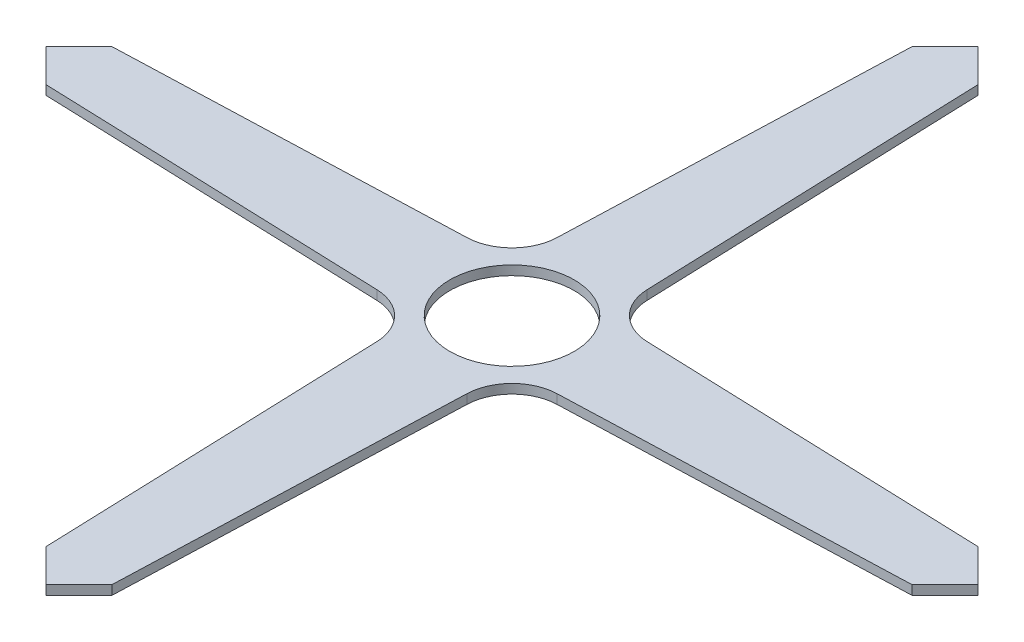
ISO-10303-21;
HEADER;
FILE_DESCRIPTION(('STEP AP214'),'2;1');
FILE_NAME('part.step','',(''),(''),'','','');
FILE_SCHEMA(('AUTOMOTIVE_DESIGN { 1 0 10303 214 1 1 1 1 }'));
ENDSEC;
DATA;
#1=APPLICATION_CONTEXT('core data for automotive mechanical design processes');
#2=APPLICATION_PROTOCOL_DEFINITION('international standard','automotive_design',2000,#1);
#3=PRODUCT_CONTEXT('',#1,'mechanical');
#4=PRODUCT('Part','Part','',(#3));
#5=PRODUCT_RELATED_PRODUCT_CATEGORY('part','',(#4));
#6=PRODUCT_DEFINITION_FORMATION('','',#4);
#7=PRODUCT_DEFINITION_CONTEXT('part definition',#1,'design');
#8=PRODUCT_DEFINITION('design','',#6,#7);
#9=PRODUCT_DEFINITION_SHAPE('','',#8);
#10=(LENGTH_UNIT() NAMED_UNIT(*) SI_UNIT(.MILLI.,.METRE.));
#11=(NAMED_UNIT(*) PLANE_ANGLE_UNIT() SI_UNIT($,.RADIAN.));
#12=(NAMED_UNIT(*) SI_UNIT($,.STERADIAN.) SOLID_ANGLE_UNIT());
#13=UNCERTAINTY_MEASURE_WITH_UNIT(LENGTH_MEASURE(1.E-05),#10,'distance_accuracy_value','');
#14=(GEOMETRIC_REPRESENTATION_CONTEXT(3) GLOBAL_UNCERTAINTY_ASSIGNED_CONTEXT((#13)) GLOBAL_UNIT_ASSIGNED_CONTEXT((#10,
#11,#12)) REPRESENTATION_CONTEXT('',''));
#15=CARTESIAN_POINT('',(0.,0.,0.));
#16=DIRECTION('',(0.,0.,1.));
#17=DIRECTION('',(1.,0.,0.));
#18=AXIS2_PLACEMENT_3D('',#15,#16,#17);
#19=CARTESIAN_POINT('',(0.,3.,0.));
#20=DIRECTION('',(0.,1.,0.));
#21=DIRECTION('',(0.,0.,1.));
#22=AXIS2_PLACEMENT_3D('',#19,#20,#21);
#23=PLANE('',#22);
#24=DIRECTION('',(-0.0352965731020605,0.,0.999376881825496));
#25=VECTOR('',#24,1.);
#26=CARTESIAN_POINT('',(-281.866601717798,3.,-139.393398282199));
#27=LINE('',#26,#25);
#28=CARTESIAN_POINT('',(-281.866601717798,3.,-139.393398282199));
#29=VERTEX_POINT('',#28);
#30=CARTESIAN_POINT('',(-285.766674338683,3.,-28.9678789695326));
#31=VERTEX_POINT('',#30);
#32=EDGE_CURVE('E181',#29,#31,#27,.T.);
#33=ORIENTED_EDGE('',*,*,#32,.T.);
#34=CARTESIAN_POINT('',(-300.757327566065,3.,-29.4973275660635));
#35=DIRECTION('',(0.,1.,0.));
#36=DIRECTION('',(0.,0.,1.));
#37=AXIS2_PLACEMENT_3D('',#34,#35,#36);
#38=CIRCLE('',#37,15.);
#39=CARTESIAN_POINT('',(-300.227878969534,3.,-14.5066743386811));
#40=VERTEX_POINT('',#39);
#41=EDGE_CURVE('E177',#31,#40,#38,.F.);
#42=ORIENTED_EDGE('',*,*,#41,.T.);
#43=DIRECTION('',(-0.999376881825495,0.,0.0352965731020729));
#44=VECTOR('',#43,1.);
#45=CARTESIAN_POINT('',(-286.259999999997,3.,-14.9999999999957));
#46=LINE('',#45,#44);
#47=CARTESIAN_POINT('',(-410.653398282202,3.,-10.6066017177952));
#48=VERTEX_POINT('',#47);
#49=EDGE_CURVE('E169',#40,#48,#46,.T.);
#50=ORIENTED_EDGE('',*,*,#49,.T.);
#51=DIRECTION('',(-0.70710678118655,0.,0.707106781186545));
#52=VECTOR('',#51,1.);
#53=CARTESIAN_POINT('',(-421.26,3.,3.04270497686332E-12));
#54=LINE('',#53,#52);
#55=CARTESIAN_POINT('',(-421.26,3.,3.04270497686332E-12));
#56=VERTEX_POINT('',#55);
#57=EDGE_CURVE('E174',#48,#56,#54,.T.);
#58=ORIENTED_EDGE('',*,*,#57,.T.);
#59=DIRECTION('',(0.70710678118655,0.,0.707106781186545));
#60=VECTOR('',#59,1.);
#61=CARTESIAN_POINT('',(-410.653398282202,3.,10.6066017178012));
#62=LINE('',#61,#60);
#63=CARTESIAN_POINT('',(-410.653398282202,3.,10.6066017178012));
#64=VERTEX_POINT('',#63);
#65=EDGE_CURVE('E196',#56,#64,#62,.T.);
#66=ORIENTED_EDGE('',*,*,#65,.T.);
#67=DIRECTION('',(0.999376881825496,0.,0.03529657310206));
#68=VECTOR('',#67,1.);
#69=CARTESIAN_POINT('',(-410.653398282202,3.,10.6066017178012));
#70=LINE('',#69,#68);
#71=CARTESIAN_POINT('',(-300.227878969536,3.,14.5066743386857));
#72=VERTEX_POINT('',#71);
#73=EDGE_CURVE('E198',#64,#72,#70,.T.);
#74=ORIENTED_EDGE('',*,*,#73,.T.);
#75=CARTESIAN_POINT('',(-300.757327566067,3.,29.4973275660681));
#76=DIRECTION('',(0.,1.,0.));
#77=DIRECTION('',(0.,0.,1.));
#78=AXIS2_PLACEMENT_3D('',#75,#76,#77);
#79=CIRCLE('',#78,15.);
#80=CARTESIAN_POINT('',(-285.766674338684,3.,28.967878969537));
#81=VERTEX_POINT('',#80);
#82=EDGE_CURVE('E319',#72,#81,#79,.F.);
#83=ORIENTED_EDGE('',*,*,#82,.T.);
#84=DIRECTION('',(0.0352965731020734,0.,0.999376881825495));
#85=VECTOR('',#84,1.);
#86=CARTESIAN_POINT('',(-286.259999999999,3.,15.0000000000002));
#87=LINE('',#86,#85);
#88=CARTESIAN_POINT('',(-281.866601717798,3.,139.393398282205));
#89=VERTEX_POINT('',#88);
#90=EDGE_CURVE('E204',#81,#89,#87,.T.);
#91=ORIENTED_EDGE('',*,*,#90,.T.);
#92=DIRECTION('',(0.707106781186542,0.,0.707106781186553));
#93=VECTOR('',#92,1.);
#94=CARTESIAN_POINT('',(-271.26,3.,150.000000000003));
#95=LINE('',#94,#93);
#96=CARTESIAN_POINT('',(-271.26,3.,150.000000000003));
#97=VERTEX_POINT('',#96);
#98=EDGE_CURVE('E206',#89,#97,#95,.T.);
#99=ORIENTED_EDGE('',*,*,#98,.T.);
#100=DIRECTION('',(0.707106781186544,0.,-0.707106781186551));
#101=VECTOR('',#100,1.);
#102=CARTESIAN_POINT('',(-260.653398282202,3.,139.393398282205));
#103=LINE('',#102,#101);
#104=CARTESIAN_POINT('',(-260.653398282202,3.,139.393398282205));
#105=VERTEX_POINT('',#104);
#106=EDGE_CURVE('E208',#97,#105,#103,.T.);
#107=ORIENTED_EDGE('',*,*,#106,.T.);
#108=DIRECTION('',(0.0352965731020596,0.,-0.999376881825496));
#109=VECTOR('',#108,1.);
#110=CARTESIAN_POINT('',(-260.653398282202,3.,139.393398282205));
#111=LINE('',#110,#109);
#112=CARTESIAN_POINT('',(-256.753325661317,3.,28.9678789695386));
#113=VERTEX_POINT('',#112);
#114=EDGE_CURVE('E210',#105,#113,#111,.T.);
#115=ORIENTED_EDGE('',*,*,#114,.T.);
#116=CARTESIAN_POINT('',(-241.762672433935,3.,29.4973275660695));
#117=DIRECTION('',(0.,1.,0.));
#118=DIRECTION('',(0.,0.,1.));
#119=AXIS2_PLACEMENT_3D('',#116,#117,#118);
#120=CIRCLE('',#119,15.);
#121=CARTESIAN_POINT('',(-242.292121030466,3.,14.5066743386871));
#122=VERTEX_POINT('',#121);
#123=EDGE_CURVE('E11',#113,#122,#120,.F.);
#124=ORIENTED_EDGE('',*,*,#123,.T.);
#125=DIRECTION('',(0.999376881825495,0.,-0.0352965731020731));
#126=VECTOR('',#125,1.);
#127=CARTESIAN_POINT('',(-256.260000000003,3.,15.0000000000017));
#128=LINE('',#127,#126);
#129=CARTESIAN_POINT('',(-131.866601717798,3.,10.6066017178011));
#130=VERTEX_POINT('',#129);
#131=EDGE_CURVE('E212',#122,#130,#128,.T.);
#132=ORIENTED_EDGE('',*,*,#131,.T.);
#133=DIRECTION('',(0.707106781186551,0.,-0.707106781186544));
#134=VECTOR('',#133,1.);
#135=CARTESIAN_POINT('',(-121.26,3.,2.98686856498032E-12));
#136=LINE('',#135,#134);
#137=CARTESIAN_POINT('',(-121.26,3.,2.98686856498032E-12));
#138=VERTEX_POINT('',#137);
#139=EDGE_CURVE('E214',#130,#138,#136,.T.);
#140=ORIENTED_EDGE('',*,*,#139,.T.);
#141=DIRECTION('',(-0.707106781186552,0.,-0.707106781186543));
#142=VECTOR('',#141,1.);
#143=CARTESIAN_POINT('',(-131.866601717798,3.,-10.6066017177953));
#144=LINE('',#143,#142);
#145=CARTESIAN_POINT('',(-131.866601717798,3.,-10.6066017177953));
#146=VERTEX_POINT('',#145);
#147=EDGE_CURVE('E216',#138,#146,#144,.T.);
#148=ORIENTED_EDGE('',*,*,#147,.T.);
#149=DIRECTION('',(-0.999376881825496,0.,-0.0352965731020599));
#150=VECTOR('',#149,1.);
#151=CARTESIAN_POINT('',(-131.866601717798,3.,-10.6066017177953));
#152=LINE('',#151,#150);
#153=CARTESIAN_POINT('',(-242.292121030465,3.,-14.5066743386797));
#154=VERTEX_POINT('',#153);
#155=EDGE_CURVE('E218',#146,#154,#152,.T.);
#156=ORIENTED_EDGE('',*,*,#155,.T.);
#157=CARTESIAN_POINT('',(-241.762672433934,3.,-29.4973275660621));
#158=DIRECTION('',(0.,1.,0.));
#159=DIRECTION('',(0.,0.,1.));
#160=AXIS2_PLACEMENT_3D('',#157,#158,#159);
#161=CIRCLE('',#160,15.);
#162=CARTESIAN_POINT('',(-256.753325661316,3.,-28.967878969531));
#163=VERTEX_POINT('',#162);
#164=EDGE_CURVE('E315',#154,#163,#161,.F.);
#165=ORIENTED_EDGE('',*,*,#164,.T.);
#166=DIRECTION('',(-0.035296573102073,0.,-0.999376881825495));
#167=VECTOR('',#166,1.);
#168=CARTESIAN_POINT('',(-256.260000000001,3.,-14.9999999999942));
#169=LINE('',#168,#167);
#170=CARTESIAN_POINT('',(-260.653398282202,3.,-139.393398282199));
#171=VERTEX_POINT('',#170);
#172=EDGE_CURVE('E221',#163,#171,#169,.T.);
#173=ORIENTED_EDGE('',*,*,#172,.T.);
#174=DIRECTION('',(-0.707106781186542,0.,-0.707106781186553));
#175=VECTOR('',#174,1.);
#176=CARTESIAN_POINT('',(-271.26,3.,-149.999999999997));
#177=LINE('',#176,#175);
#178=CARTESIAN_POINT('',(-271.26,3.,-149.999999999997));
#179=VERTEX_POINT('',#178);
#180=EDGE_CURVE('E223',#171,#179,#177,.T.);
#181=ORIENTED_EDGE('',*,*,#180,.T.);
#182=DIRECTION('',(-0.707106781186544,0.,0.707106781186551));
#183=VECTOR('',#182,1.);
#184=CARTESIAN_POINT('',(-281.866601717798,3.,-139.393398282199));
#185=LINE('',#184,#183);
#186=EDGE_CURVE('E225',#179,#29,#185,.T.);
#187=ORIENTED_EDGE('',*,*,#186,.T.);
#188=EDGE_LOOP('',(#33,#42,#50,#58,#66,#74,#83,#91,#99,#107,#115,#124,#132,#140,#148,#156,#165,
#173,#181,#187));
#189=FACE_BOUND('',#188,.T.);
#190=CARTESIAN_POINT('',(-271.26,3.,3.01478677092182E-12));
#191=DIRECTION('',(0.,1.,0.));
#192=DIRECTION('',(0.,0.,1.));
#193=AXIS2_PLACEMENT_3D('',#190,#191,#192);
#194=CIRCLE('',#193,20.);
#195=CARTESIAN_POINT('',(-271.26,3.,20.000000000003));
#196=VERTEX_POINT('',#195);
#197=EDGE_CURVE('E231',#196,#196,#194,.T.);
#198=ORIENTED_EDGE('',*,*,#197,.F.);
#199=EDGE_LOOP('',(#198));
#200=FACE_BOUND('',#199,.T.);
#201=ADVANCED_FACE('F33',(#189,#200),#23,.T.);
#202=CARTESIAN_POINT('',(0.,0.,0.));
#203=DIRECTION('',(0.,1.,0.));
#204=DIRECTION('',(0.,0.,1.));
#205=AXIS2_PLACEMENT_3D('',#202,#203,#204);
#206=PLANE('',#205);
#207=DIRECTION('',(-0.0352965731020605,0.,0.999376881825496));
#208=VECTOR('',#207,1.);
#209=CARTESIAN_POINT('',(-281.866601717798,0.,-139.393398282199));
#210=LINE('',#209,#208);
#211=CARTESIAN_POINT('',(-281.866601717798,0.,-139.393398282199));
#212=VERTEX_POINT('',#211);
#213=CARTESIAN_POINT('',(-285.766674338683,0.,-28.9678789695326));
#214=VERTEX_POINT('',#213);
#215=EDGE_CURVE('E228',#212,#214,#210,.T.);
#216=ORIENTED_EDGE('',*,*,#215,.F.);
#217=DIRECTION('',(-0.707106781186544,0.,0.707106781186551));
#218=VECTOR('',#217,1.);
#219=CARTESIAN_POINT('',(-281.866601717798,0.,-139.393398282199));
#220=LINE('',#219,#218);
#221=CARTESIAN_POINT('',(-271.26,0.,-149.999999999997));
#222=VERTEX_POINT('',#221);
#223=EDGE_CURVE('E261',#222,#212,#220,.T.);
#224=ORIENTED_EDGE('',*,*,#223,.F.);
#225=DIRECTION('',(-0.707106781186542,0.,-0.707106781186553));
#226=VECTOR('',#225,1.);
#227=CARTESIAN_POINT('',(-271.26,0.,-149.999999999997));
#228=LINE('',#227,#226);
#229=CARTESIAN_POINT('',(-260.653398282202,0.,-139.393398282199));
#230=VERTEX_POINT('',#229);
#231=EDGE_CURVE('E259',#230,#222,#228,.T.);
#232=ORIENTED_EDGE('',*,*,#231,.F.);
#233=DIRECTION('',(-0.035296573102073,0.,-0.999376881825495));
#234=VECTOR('',#233,1.);
#235=CARTESIAN_POINT('',(-256.260000000001,0.,-14.9999999999942));
#236=LINE('',#235,#234);
#237=CARTESIAN_POINT('',(-256.753325661316,0.,-28.967878969531));
#238=VERTEX_POINT('',#237);
#239=EDGE_CURVE('E257',#238,#230,#236,.T.);
#240=ORIENTED_EDGE('',*,*,#239,.F.);
#241=CARTESIAN_POINT('',(-241.762672433934,0.,-29.4973275660621));
#242=DIRECTION('',(0.,1.,0.));
#243=DIRECTION('',(0.,0.,1.));
#244=AXIS2_PLACEMENT_3D('',#241,#242,#243);
#245=CIRCLE('',#244,15.);
#246=CARTESIAN_POINT('',(-242.292121030465,0.,-14.5066743386797));
#247=VERTEX_POINT('',#246);
#248=EDGE_CURVE('E313',#238,#247,#245,.T.);
#249=ORIENTED_EDGE('',*,*,#248,.T.);
#250=DIRECTION('',(-0.999376881825496,0.,-0.0352965731020599));
#251=VECTOR('',#250,1.);
#252=CARTESIAN_POINT('',(-131.866601717798,0.,-10.6066017177953));
#253=LINE('',#252,#251);
#254=CARTESIAN_POINT('',(-131.866601717798,0.,-10.6066017177953));
#255=VERTEX_POINT('',#254);
#256=EDGE_CURVE('E254',#255,#247,#253,.T.);
#257=ORIENTED_EDGE('',*,*,#256,.F.);
#258=DIRECTION('',(-0.707106781186552,0.,-0.707106781186543));
#259=VECTOR('',#258,1.);
#260=CARTESIAN_POINT('',(-131.866601717798,0.,-10.6066017177953));
#261=LINE('',#260,#259);
#262=CARTESIAN_POINT('',(-121.26,0.,2.98686856498032E-12));
#263=VERTEX_POINT('',#262);
#264=EDGE_CURVE('E252',#263,#255,#261,.T.);
#265=ORIENTED_EDGE('',*,*,#264,.F.);
#266=DIRECTION('',(0.707106781186551,0.,-0.707106781186544));
#267=VECTOR('',#266,1.);
#268=CARTESIAN_POINT('',(-121.26,0.,2.98686856498032E-12));
#269=LINE('',#268,#267);
#270=CARTESIAN_POINT('',(-131.866601717798,0.,10.6066017178011));
#271=VERTEX_POINT('',#270);
#272=EDGE_CURVE('E250',#271,#263,#269,.T.);
#273=ORIENTED_EDGE('',*,*,#272,.F.);
#274=DIRECTION('',(0.999376881825495,0.,-0.0352965731020731));
#275=VECTOR('',#274,1.);
#276=CARTESIAN_POINT('',(-256.260000000003,0.,15.0000000000017));
#277=LINE('',#276,#275);
#278=CARTESIAN_POINT('',(-242.292121030466,0.,14.5066743386871));
#279=VERTEX_POINT('',#278);
#280=EDGE_CURVE('E248',#279,#271,#277,.T.);
#281=ORIENTED_EDGE('',*,*,#280,.F.);
#282=CARTESIAN_POINT('',(-241.762672433935,0.,29.4973275660695));
#283=DIRECTION('',(0.,1.,0.));
#284=DIRECTION('',(0.,0.,1.));
#285=AXIS2_PLACEMENT_3D('',#282,#283,#284);
#286=CIRCLE('',#285,15.);
#287=CARTESIAN_POINT('',(-256.753325661317,0.,28.9678789695386));
#288=VERTEX_POINT('',#287);
#289=EDGE_CURVE('E41',#279,#288,#286,.T.);
#290=ORIENTED_EDGE('',*,*,#289,.T.);
#291=DIRECTION('',(0.0352965731020596,0.,-0.999376881825496));
#292=VECTOR('',#291,1.);
#293=CARTESIAN_POINT('',(-260.653398282202,0.,139.393398282205));
#294=LINE('',#293,#292);
#295=CARTESIAN_POINT('',(-260.653398282202,0.,139.393398282205));
#296=VERTEX_POINT('',#295);
#297=EDGE_CURVE('E246',#296,#288,#294,.T.);
#298=ORIENTED_EDGE('',*,*,#297,.F.);
#299=DIRECTION('',(0.707106781186544,0.,-0.707106781186551));
#300=VECTOR('',#299,1.);
#301=CARTESIAN_POINT('',(-260.653398282202,0.,139.393398282205));
#302=LINE('',#301,#300);
#303=CARTESIAN_POINT('',(-271.26,0.,150.000000000003));
#304=VERTEX_POINT('',#303);
#305=EDGE_CURVE('E244',#304,#296,#302,.T.);
#306=ORIENTED_EDGE('',*,*,#305,.F.);
#307=DIRECTION('',(0.707106781186542,0.,0.707106781186553));
#308=VECTOR('',#307,1.);
#309=CARTESIAN_POINT('',(-271.26,0.,150.000000000003));
#310=LINE('',#309,#308);
#311=CARTESIAN_POINT('',(-281.866601717798,0.,139.393398282205));
#312=VERTEX_POINT('',#311);
#313=EDGE_CURVE('E242',#312,#304,#310,.T.);
#314=ORIENTED_EDGE('',*,*,#313,.F.);
#315=DIRECTION('',(0.0352965731020734,0.,0.999376881825495));
#316=VECTOR('',#315,1.);
#317=CARTESIAN_POINT('',(-286.259999999999,0.,15.0000000000002));
#318=LINE('',#317,#316);
#319=CARTESIAN_POINT('',(-285.766674338684,0.,28.967878969537));
#320=VERTEX_POINT('',#319);
#321=EDGE_CURVE('E240',#320,#312,#318,.T.);
#322=ORIENTED_EDGE('',*,*,#321,.F.);
#323=CARTESIAN_POINT('',(-300.757327566067,0.,29.4973275660681));
#324=DIRECTION('',(0.,1.,0.));
#325=DIRECTION('',(0.,0.,1.));
#326=AXIS2_PLACEMENT_3D('',#323,#324,#325);
#327=CIRCLE('',#326,15.);
#328=CARTESIAN_POINT('',(-300.227878969536,0.,14.5066743386857));
#329=VERTEX_POINT('',#328);
#330=EDGE_CURVE('E317',#320,#329,#327,.T.);
#331=ORIENTED_EDGE('',*,*,#330,.T.);
#332=DIRECTION('',(0.999376881825496,0.,0.03529657310206));
#333=VECTOR('',#332,1.);
#334=CARTESIAN_POINT('',(-410.653398282202,0.,10.6066017178012));
#335=LINE('',#334,#333);
#336=CARTESIAN_POINT('',(-410.653398282202,0.,10.6066017178012));
#337=VERTEX_POINT('',#336);
#338=EDGE_CURVE('E237',#337,#329,#335,.T.);
#339=ORIENTED_EDGE('',*,*,#338,.F.);
#340=DIRECTION('',(0.70710678118655,0.,0.707106781186545));
#341=VECTOR('',#340,1.);
#342=CARTESIAN_POINT('',(-410.653398282202,0.,10.6066017178012));
#343=LINE('',#342,#341);
#344=CARTESIAN_POINT('',(-421.26,0.,3.04270497686332E-12));
#345=VERTEX_POINT('',#344);
#346=EDGE_CURVE('E235',#345,#337,#343,.T.);
#347=ORIENTED_EDGE('',*,*,#346,.F.);
#348=DIRECTION('',(-0.70710678118655,0.,0.707106781186545));
#349=VECTOR('',#348,1.);
#350=CARTESIAN_POINT('',(-421.26,0.,3.04270497686332E-12));
#351=LINE('',#350,#349);
#352=CARTESIAN_POINT('',(-410.653398282202,0.,-10.6066017177952));
#353=VERTEX_POINT('',#352);
#354=EDGE_CURVE('E233',#353,#345,#351,.T.);
#355=ORIENTED_EDGE('',*,*,#354,.F.);
#356=DIRECTION('',(-0.999376881825495,0.,0.0352965731020729));
#357=VECTOR('',#356,1.);
#358=CARTESIAN_POINT('',(-286.259999999997,0.,-14.9999999999957));
#359=LINE('',#358,#357);
#360=CARTESIAN_POINT('',(-300.227878969534,0.,-14.5066743386811));
#361=VERTEX_POINT('',#360);
#362=EDGE_CURVE('E187',#361,#353,#359,.T.);
#363=ORIENTED_EDGE('',*,*,#362,.F.);
#364=CARTESIAN_POINT('',(-300.757327566065,0.,-29.4973275660635));
#365=DIRECTION('',(0.,1.,0.));
#366=DIRECTION('',(0.,0.,1.));
#367=AXIS2_PLACEMENT_3D('',#364,#365,#366);
#368=CIRCLE('',#367,15.);
#369=EDGE_CURVE('E310',#361,#214,#368,.T.);
#370=ORIENTED_EDGE('',*,*,#369,.T.);
#371=EDGE_LOOP('',(#216,#224,#232,#240,#249,#257,#265,#273,#281,#290,#298,#306,#314,#322,#331,
#339,#347,#355,#363,#370));
#372=FACE_BOUND('',#371,.T.);
#373=CARTESIAN_POINT('',(-271.26,0.,3.01478677092182E-12));
#374=DIRECTION('',(0.,1.,0.));
#375=DIRECTION('',(0.,0.,1.));
#376=AXIS2_PLACEMENT_3D('',#373,#374,#375);
#377=CIRCLE('',#376,20.);
#378=CARTESIAN_POINT('',(-271.26,0.,20.000000000003));
#379=VERTEX_POINT('',#378);
#380=EDGE_CURVE('E580',#379,#379,#377,.T.);
#381=ORIENTED_EDGE('',*,*,#380,.T.);
#382=EDGE_LOOP('',(#381));
#383=FACE_BOUND('',#382,.T.);
#384=ADVANCED_FACE('F334',(#372,#383),#206,.F.);
#385=CARTESIAN_POINT('',(-281.866601717798,3.,-139.393398282199));
#386=DIRECTION('',(0.999376881825496,0.,0.0352965731020605));
#387=DIRECTION('',(0.0352965731020605,0.,-0.999376881825496));
#388=AXIS2_PLACEMENT_3D('',#385,#386,#387);
#389=PLANE('',#388);
#390=ORIENTED_EDGE('',*,*,#215,.T.);
#391=DIRECTION('',(0.,-1.,0.));
#392=VECTOR('',#391,1.);
#393=CARTESIAN_POINT('',(-285.766674338683,3.,-28.9678789695326));
#394=LINE('',#393,#392);
#395=EDGE_CURVE('E294',#214,#31,#394,.F.);
#396=ORIENTED_EDGE('',*,*,#395,.T.);
#397=ORIENTED_EDGE('',*,*,#32,.F.);
#398=DIRECTION('',(0.,-1.,0.));
#399=VECTOR('',#398,1.);
#400=CARTESIAN_POINT('',(-281.866601717798,3.,-139.393398282199));
#401=LINE('',#400,#399);
#402=EDGE_CURVE('E227',#29,#212,#401,.T.);
#403=ORIENTED_EDGE('',*,*,#402,.T.);
#404=EDGE_LOOP('',(#390,#396,#397,#403));
#405=FACE_BOUND('',#404,.T.);
#406=ADVANCED_FACE('F347',(#405),#389,.F.);
#407=CARTESIAN_POINT('',(-286.259999999997,3.,-14.9999999999957));
#408=DIRECTION('',(0.0352965731020729,0.,0.999376881825495));
#409=DIRECTION('',(0.999376881825495,0.,-0.0352965731020729));
#410=AXIS2_PLACEMENT_3D('',#407,#408,#409);
#411=PLANE('',#410);
#412=ORIENTED_EDGE('',*,*,#49,.F.);
#413=DIRECTION('',(0.,-1.,0.));
#414=VECTOR('',#413,1.);
#415=CARTESIAN_POINT('',(-300.227878969534,0.,-14.5066743386811));
#416=LINE('',#415,#414);
#417=EDGE_CURVE('E190',#40,#361,#416,.T.);
#418=ORIENTED_EDGE('',*,*,#417,.T.);
#419=ORIENTED_EDGE('',*,*,#362,.T.);
#420=DIRECTION('',(0.,-1.,0.));
#421=VECTOR('',#420,1.);
#422=CARTESIAN_POINT('',(-410.653398282202,3.,-10.6066017177952));
#423=LINE('',#422,#421);
#424=EDGE_CURVE('E184',#48,#353,#423,.T.);
#425=ORIENTED_EDGE('',*,*,#424,.F.);
#426=EDGE_LOOP('',(#412,#418,#419,#425));
#427=FACE_BOUND('',#426,.T.);
#428=ADVANCED_FACE('F185',(#427),#411,.F.);
#429=CARTESIAN_POINT('',(-421.26,3.,3.04270497686332E-12));
#430=DIRECTION('',(0.707106781186545,0.,0.70710678118655));
#431=DIRECTION('',(0.70710678118655,0.,-0.707106781186545));
#432=AXIS2_PLACEMENT_3D('',#429,#430,#431);
#433=PLANE('',#432);
#434=ORIENTED_EDGE('',*,*,#354,.T.);
#435=DIRECTION('',(0.,-1.,0.));
#436=VECTOR('',#435,1.);
#437=CARTESIAN_POINT('',(-421.26,3.,3.04270497686332E-12));
#438=LINE('',#437,#436);
#439=EDGE_CURVE('E191',#56,#345,#438,.T.);
#440=ORIENTED_EDGE('',*,*,#439,.F.);
#441=ORIENTED_EDGE('',*,*,#57,.F.);
#442=ORIENTED_EDGE('',*,*,#424,.T.);
#443=EDGE_LOOP('',(#434,#440,#441,#442));
#444=FACE_BOUND('',#443,.T.);
#445=ADVANCED_FACE('F193',(#444),#433,.F.);
#446=CARTESIAN_POINT('',(-410.653398282202,3.,10.6066017178012));
#447=DIRECTION('',(0.707106781186545,0.,-0.70710678118655));
#448=DIRECTION('',(-0.70710678118655,0.,-0.707106781186545));
#449=AXIS2_PLACEMENT_3D('',#446,#447,#448);
#450=PLANE('',#449);
#451=ORIENTED_EDGE('',*,*,#346,.T.);
#452=DIRECTION('',(0.,-1.,0.));
#453=VECTOR('',#452,1.);
#454=CARTESIAN_POINT('',(-410.653398282202,3.,10.6066017178012));
#455=LINE('',#454,#453);
#456=EDGE_CURVE('E289',#64,#337,#455,.T.);
#457=ORIENTED_EDGE('',*,*,#456,.F.);
#458=ORIENTED_EDGE('',*,*,#65,.F.);
#459=ORIENTED_EDGE('',*,*,#439,.T.);
#460=EDGE_LOOP('',(#451,#457,#458,#459));
#461=FACE_BOUND('',#460,.T.);
#462=ADVANCED_FACE('F342',(#461),#450,.F.);
#463=CARTESIAN_POINT('',(-410.653398282202,3.,10.6066017178012));
#464=DIRECTION('',(0.03529657310206,0.,-0.999376881825496));
#465=DIRECTION('',(-0.999376881825496,0.,-0.03529657310206));
#466=AXIS2_PLACEMENT_3D('',#463,#464,#465);
#467=PLANE('',#466);
#468=ORIENTED_EDGE('',*,*,#338,.T.);
#469=DIRECTION('',(0.,-1.,0.));
#470=VECTOR('',#469,1.);
#471=CARTESIAN_POINT('',(-300.227878969536,3.,14.5066743386857));
#472=LINE('',#471,#470);
#473=EDGE_CURVE('E304',#329,#72,#472,.F.);
#474=ORIENTED_EDGE('',*,*,#473,.T.);
#475=ORIENTED_EDGE('',*,*,#73,.F.);
#476=ORIENTED_EDGE('',*,*,#456,.T.);
#477=EDGE_LOOP('',(#468,#474,#475,#476));
#478=FACE_BOUND('',#477,.T.);
#479=ADVANCED_FACE('F339',(#478),#467,.F.);
#480=CARTESIAN_POINT('',(-286.259999999999,3.,15.0000000000002));
#481=DIRECTION('',(0.999376881825495,0.,-0.0352965731020734));
#482=DIRECTION('',(-0.0352965731020734,0.,-0.999376881825495));
#483=AXIS2_PLACEMENT_3D('',#480,#481,#482);
#484=PLANE('',#483);
#485=ORIENTED_EDGE('',*,*,#90,.F.);
#486=DIRECTION('',(0.,-1.,0.));
#487=VECTOR('',#486,1.);
#488=CARTESIAN_POINT('',(-285.766674338684,0.,28.967878969537));
#489=LINE('',#488,#487);
#490=EDGE_CURVE('E301',#81,#320,#489,.T.);
#491=ORIENTED_EDGE('',*,*,#490,.T.);
#492=ORIENTED_EDGE('',*,*,#321,.T.);
#493=DIRECTION('',(0.,-1.,0.));
#494=VECTOR('',#493,1.);
#495=CARTESIAN_POINT('',(-281.866601717798,3.,139.393398282205));
#496=LINE('',#495,#494);
#497=EDGE_CURVE('E286',#89,#312,#496,.T.);
#498=ORIENTED_EDGE('',*,*,#497,.F.);
#499=EDGE_LOOP('',(#485,#491,#492,#498));
#500=FACE_BOUND('',#499,.T.);
#501=ADVANCED_FACE('F328',(#500),#484,.F.);
#502=CARTESIAN_POINT('',(-271.26,3.,150.000000000003));
#503=DIRECTION('',(0.707106781186553,0.,-0.707106781186542));
#504=DIRECTION('',(-0.707106781186542,0.,-0.707106781186553));
#505=AXIS2_PLACEMENT_3D('',#502,#503,#504);
#506=PLANE('',#505);
#507=ORIENTED_EDGE('',*,*,#313,.T.);
#508=DIRECTION('',(0.,-1.,0.));
#509=VECTOR('',#508,1.);
#510=CARTESIAN_POINT('',(-271.26,3.,150.000000000003));
#511=LINE('',#510,#509);
#512=EDGE_CURVE('E283',#97,#304,#511,.T.);
#513=ORIENTED_EDGE('',*,*,#512,.F.);
#514=ORIENTED_EDGE('',*,*,#98,.F.);
#515=ORIENTED_EDGE('',*,*,#497,.T.);
#516=EDGE_LOOP('',(#507,#513,#514,#515));
#517=FACE_BOUND('',#516,.T.);
#518=ADVANCED_FACE('F405',(#517),#506,.F.);
#519=CARTESIAN_POINT('',(-260.653398282202,3.,139.393398282205));
#520=DIRECTION('',(-0.707106781186551,0.,-0.707106781186544));
#521=DIRECTION('',(-0.707106781186544,0.,0.707106781186551));
#522=AXIS2_PLACEMENT_3D('',#519,#520,#521);
#523=PLANE('',#522);
#524=ORIENTED_EDGE('',*,*,#305,.T.);
#525=DIRECTION('',(0.,-1.,0.));
#526=VECTOR('',#525,1.);
#527=CARTESIAN_POINT('',(-260.653398282202,3.,139.393398282205));
#528=LINE('',#527,#526);
#529=EDGE_CURVE('E280',#105,#296,#528,.T.);
#530=ORIENTED_EDGE('',*,*,#529,.F.);
#531=ORIENTED_EDGE('',*,*,#106,.F.);
#532=ORIENTED_EDGE('',*,*,#512,.T.);
#533=EDGE_LOOP('',(#524,#530,#531,#532));
#534=FACE_BOUND('',#533,.T.);
#535=ADVANCED_FACE('F402',(#534),#523,.F.);
#536=CARTESIAN_POINT('',(-260.653398282202,3.,139.393398282205));
#537=DIRECTION('',(-0.999376881825496,0.,-0.0352965731020596));
#538=DIRECTION('',(-0.0352965731020596,0.,0.999376881825496));
#539=AXIS2_PLACEMENT_3D('',#536,#537,#538);
#540=PLANE('',#539);
#541=ORIENTED_EDGE('',*,*,#297,.T.);
#542=DIRECTION('',(0.,-1.,0.));
#543=VECTOR('',#542,1.);
#544=CARTESIAN_POINT('',(-256.753325661317,3.,28.9678789695386));
#545=LINE('',#544,#543);
#546=EDGE_CURVE('E48',#288,#113,#545,.F.);
#547=ORIENTED_EDGE('',*,*,#546,.T.);
#548=ORIENTED_EDGE('',*,*,#114,.F.);
#549=ORIENTED_EDGE('',*,*,#529,.T.);
#550=EDGE_LOOP('',(#541,#547,#548,#549));
#551=FACE_BOUND('',#550,.T.);
#552=ADVANCED_FACE('F398',(#551),#540,.F.);
#553=CARTESIAN_POINT('',(-256.260000000003,3.,15.0000000000017));
#554=DIRECTION('',(-0.0352965731020731,0.,-0.999376881825495));
#555=DIRECTION('',(-0.999376881825495,0.,0.0352965731020731));
#556=AXIS2_PLACEMENT_3D('',#553,#554,#555);
#557=PLANE('',#556);
#558=ORIENTED_EDGE('',*,*,#131,.F.);
#559=DIRECTION('',(0.,-1.,0.));
#560=VECTOR('',#559,1.);
#561=CARTESIAN_POINT('',(-242.292121030466,0.,14.5066743386871));
#562=LINE('',#561,#560);
#563=EDGE_CURVE('E306',#122,#279,#562,.T.);
#564=ORIENTED_EDGE('',*,*,#563,.T.);
#565=ORIENTED_EDGE('',*,*,#280,.T.);
#566=DIRECTION('',(0.,-1.,0.));
#567=VECTOR('',#566,1.);
#568=CARTESIAN_POINT('',(-131.866601717798,3.,10.6066017178011));
#569=LINE('',#568,#567);
#570=EDGE_CURVE('E277',#130,#271,#569,.T.);
#571=ORIENTED_EDGE('',*,*,#570,.F.);
#572=EDGE_LOOP('',(#558,#564,#565,#571));
#573=FACE_BOUND('',#572,.T.);
#574=ADVANCED_FACE('F394',(#573),#557,.F.);
#575=CARTESIAN_POINT('',(-121.26,3.,2.98686856498032E-12));
#576=DIRECTION('',(-0.707106781186544,0.,-0.707106781186551));
#577=DIRECTION('',(-0.707106781186551,0.,0.707106781186544));
#578=AXIS2_PLACEMENT_3D('',#575,#576,#577);
#579=PLANE('',#578);
#580=ORIENTED_EDGE('',*,*,#272,.T.);
#581=DIRECTION('',(0.,-1.,0.));
#582=VECTOR('',#581,1.);
#583=CARTESIAN_POINT('',(-121.26,3.,2.98686856498032E-12));
#584=LINE('',#583,#582);
#585=EDGE_CURVE('E274',#138,#263,#584,.T.);
#586=ORIENTED_EDGE('',*,*,#585,.F.);
#587=ORIENTED_EDGE('',*,*,#139,.F.);
#588=ORIENTED_EDGE('',*,*,#570,.T.);
#589=EDGE_LOOP('',(#580,#586,#587,#588));
#590=FACE_BOUND('',#589,.T.);
#591=ADVANCED_FACE('F390',(#590),#579,.F.);
#592=CARTESIAN_POINT('',(-131.866601717798,3.,-10.6066017177953));
#593=DIRECTION('',(-0.707106781186543,0.,0.707106781186552));
#594=DIRECTION('',(0.707106781186552,0.,0.707106781186543));
#595=AXIS2_PLACEMENT_3D('',#592,#593,#594);
#596=PLANE('',#595);
#597=ORIENTED_EDGE('',*,*,#264,.T.);
#598=DIRECTION('',(0.,-1.,0.));
#599=VECTOR('',#598,1.);
#600=CARTESIAN_POINT('',(-131.866601717798,3.,-10.6066017177953));
#601=LINE('',#600,#599);
#602=EDGE_CURVE('E271',#146,#255,#601,.T.);
#603=ORIENTED_EDGE('',*,*,#602,.F.);
#604=ORIENTED_EDGE('',*,*,#147,.F.);
#605=ORIENTED_EDGE('',*,*,#585,.T.);
#606=EDGE_LOOP('',(#597,#603,#604,#605));
#607=FACE_BOUND('',#606,.T.);
#608=ADVANCED_FACE('F386',(#607),#596,.F.);
#609=CARTESIAN_POINT('',(-131.866601717798,3.,-10.6066017177953));
#610=DIRECTION('',(-0.0352965731020599,0.,0.999376881825496));
#611=DIRECTION('',(0.999376881825496,0.,0.0352965731020599));
#612=AXIS2_PLACEMENT_3D('',#609,#610,#611);
#613=PLANE('',#612);
#614=ORIENTED_EDGE('',*,*,#256,.T.);
#615=DIRECTION('',(0.,-1.,0.));
#616=VECTOR('',#615,1.);
#617=CARTESIAN_POINT('',(-242.292121030465,3.,-14.5066743386797));
#618=LINE('',#617,#616);
#619=EDGE_CURVE('E299',#247,#154,#618,.F.);
#620=ORIENTED_EDGE('',*,*,#619,.T.);
#621=ORIENTED_EDGE('',*,*,#155,.F.);
#622=ORIENTED_EDGE('',*,*,#602,.T.);
#623=EDGE_LOOP('',(#614,#620,#621,#622));
#624=FACE_BOUND('',#623,.T.);
#625=ADVANCED_FACE('F382',(#624),#613,.F.);
#626=CARTESIAN_POINT('',(-256.260000000001,3.,-14.9999999999942));
#627=DIRECTION('',(-0.999376881825495,0.,0.035296573102073));
#628=DIRECTION('',(0.035296573102073,0.,0.999376881825495));
#629=AXIS2_PLACEMENT_3D('',#626,#627,#628);
#630=PLANE('',#629);
#631=ORIENTED_EDGE('',*,*,#172,.F.);
#632=DIRECTION('',(0.,-1.,0.));
#633=VECTOR('',#632,1.);
#634=CARTESIAN_POINT('',(-256.753325661316,0.,-28.967878969531));
#635=LINE('',#634,#633);
#636=EDGE_CURVE('E296',#163,#238,#635,.T.);
#637=ORIENTED_EDGE('',*,*,#636,.T.);
#638=ORIENTED_EDGE('',*,*,#239,.T.);
#639=DIRECTION('',(0.,-1.,0.));
#640=VECTOR('',#639,1.);
#641=CARTESIAN_POINT('',(-260.653398282202,3.,-139.393398282199));
#642=LINE('',#641,#640);
#643=EDGE_CURVE('E268',#171,#230,#642,.T.);
#644=ORIENTED_EDGE('',*,*,#643,.F.);
#645=EDGE_LOOP('',(#631,#637,#638,#644));
#646=FACE_BOUND('',#645,.T.);
#647=ADVANCED_FACE('F378',(#646),#630,.F.);
#648=CARTESIAN_POINT('',(-271.26,3.,-149.999999999997));
#649=DIRECTION('',(-0.707106781186553,0.,0.707106781186542));
#650=DIRECTION('',(0.707106781186542,0.,0.707106781186553));
#651=AXIS2_PLACEMENT_3D('',#648,#649,#650);
#652=PLANE('',#651);
#653=ORIENTED_EDGE('',*,*,#231,.T.);
#654=DIRECTION('',(0.,-1.,0.));
#655=VECTOR('',#654,1.);
#656=CARTESIAN_POINT('',(-271.26,3.,-149.999999999997));
#657=LINE('',#656,#655);
#658=EDGE_CURVE('E265',#179,#222,#657,.T.);
#659=ORIENTED_EDGE('',*,*,#658,.F.);
#660=ORIENTED_EDGE('',*,*,#180,.F.);
#661=ORIENTED_EDGE('',*,*,#643,.T.);
#662=EDGE_LOOP('',(#653,#659,#660,#661));
#663=FACE_BOUND('',#662,.T.);
#664=ADVANCED_FACE('F374',(#663),#652,.F.);
#665=CARTESIAN_POINT('',(-281.866601717798,3.,-139.393398282199));
#666=DIRECTION('',(0.707106781186551,0.,0.707106781186544));
#667=DIRECTION('',(0.707106781186544,0.,-0.707106781186551));
#668=AXIS2_PLACEMENT_3D('',#665,#666,#667);
#669=PLANE('',#668);
#670=ORIENTED_EDGE('',*,*,#223,.T.);
#671=ORIENTED_EDGE('',*,*,#402,.F.);
#672=ORIENTED_EDGE('',*,*,#186,.F.);
#673=ORIENTED_EDGE('',*,*,#658,.T.);
#674=EDGE_LOOP('',(#670,#671,#672,#673));
#675=FACE_BOUND('',#674,.T.);
#676=ADVANCED_FACE('F361',(#675),#669,.F.);
#677=CARTESIAN_POINT('',(-271.26,3.,3.01478677092182E-12));
#678=DIRECTION('',(0.,-1.,0.));
#679=DIRECTION('',(0.,0.,-1.));
#680=AXIS2_PLACEMENT_3D('',#677,#678,#679);
#681=CYLINDRICAL_SURFACE('',#680,20.);
#682=ORIENTED_EDGE('',*,*,#197,.T.);
#683=EDGE_LOOP('',(#682));
#684=FACE_BOUND('',#683,.T.);
#685=ORIENTED_EDGE('',*,*,#380,.F.);
#686=EDGE_LOOP('',(#685));
#687=FACE_BOUND('',#686,.T.);
#688=ADVANCED_FACE('F353',(#684,#687),#681,.F.);
#689=CARTESIAN_POINT('',(-300.757327566065,3.,-29.4973275660635));
#690=DIRECTION('',(0.,1.,0.));
#691=DIRECTION('',(0.,0.,1.));
#692=AXIS2_PLACEMENT_3D('',#689,#690,#691);
#693=CYLINDRICAL_SURFACE('',#692,15.);
#694=ORIENTED_EDGE('',*,*,#41,.F.);
#695=ORIENTED_EDGE('',*,*,#395,.F.);
#696=ORIENTED_EDGE('',*,*,#369,.F.);
#697=ORIENTED_EDGE('',*,*,#417,.F.);
#698=EDGE_LOOP('',(#694,#695,#696,#697));
#699=FACE_BOUND('',#698,.T.);
#700=ADVANCED_FACE('F350',(#699),#693,.F.);
#701=CARTESIAN_POINT('',(-241.762672433934,3.,-29.4973275660621));
#702=DIRECTION('',(0.,1.,0.));
#703=DIRECTION('',(0.,0.,1.));
#704=AXIS2_PLACEMENT_3D('',#701,#702,#703);
#705=CYLINDRICAL_SURFACE('',#704,15.);
#706=ORIENTED_EDGE('',*,*,#164,.F.);
#707=ORIENTED_EDGE('',*,*,#619,.F.);
#708=ORIENTED_EDGE('',*,*,#248,.F.);
#709=ORIENTED_EDGE('',*,*,#636,.F.);
#710=EDGE_LOOP('',(#706,#707,#708,#709));
#711=FACE_BOUND('',#710,.T.);
#712=ADVANCED_FACE('F352',(#711),#705,.F.);
#713=CARTESIAN_POINT('',(-300.757327566067,3.,29.4973275660681));
#714=DIRECTION('',(0.,1.,0.));
#715=DIRECTION('',(0.,0.,1.));
#716=AXIS2_PLACEMENT_3D('',#713,#714,#715);
#717=CYLINDRICAL_SURFACE('',#716,15.);
#718=ORIENTED_EDGE('',*,*,#82,.F.);
#719=ORIENTED_EDGE('',*,*,#473,.F.);
#720=ORIENTED_EDGE('',*,*,#330,.F.);
#721=ORIENTED_EDGE('',*,*,#490,.F.);
#722=EDGE_LOOP('',(#718,#719,#720,#721));
#723=FACE_BOUND('',#722,.T.);
#724=ADVANCED_FACE('F331',(#723),#717,.F.);
#725=CARTESIAN_POINT('',(-241.762672433935,3.,29.4973275660695));
#726=DIRECTION('',(0.,1.,0.));
#727=DIRECTION('',(0.,0.,1.));
#728=AXIS2_PLACEMENT_3D('',#725,#726,#727);
#729=CYLINDRICAL_SURFACE('',#728,15.);
#730=ORIENTED_EDGE('',*,*,#123,.F.);
#731=ORIENTED_EDGE('',*,*,#546,.F.);
#732=ORIENTED_EDGE('',*,*,#289,.F.);
#733=ORIENTED_EDGE('',*,*,#563,.F.);
#734=EDGE_LOOP('',(#730,#731,#732,#733));
#735=FACE_BOUND('',#734,.T.);
#736=ADVANCED_FACE('F35',(#735),#729,.F.);
#737=CLOSED_SHELL('',(#201,#384,#406,#428,#445,#462,#479,#501,#518,#535,#552,#574,#591,#608,
#625,#647,#664,#676,#688,#700,#712,#724,#736));
#738=MANIFOLD_SOLID_BREP('B2',#737);
#739=ADVANCED_BREP_SHAPE_REPRESENTATION('',(#18,#738),#14);
#740=SHAPE_DEFINITION_REPRESENTATION(#9,#739);
ENDSEC;
END-ISO-10303-21;
